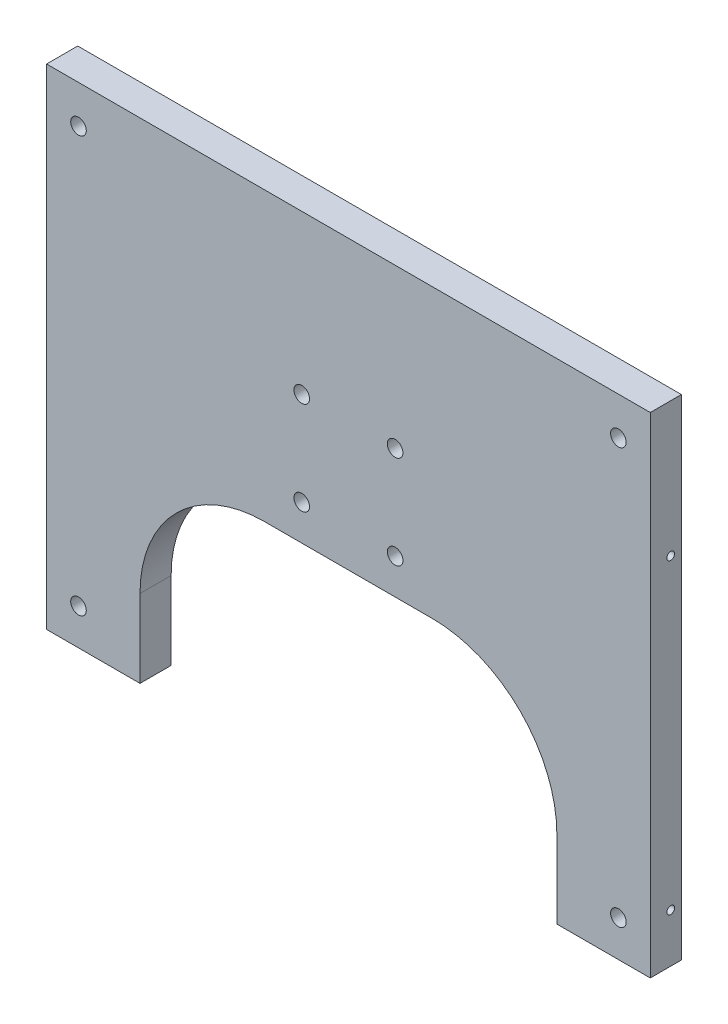
ISO-10303-21;
HEADER;
FILE_DESCRIPTION(('STEP AP214'),'2;1');
FILE_NAME('part.step','',(''),(''),'','','');
FILE_SCHEMA(('AUTOMOTIVE_DESIGN { 1 0 10303 214 1 1 1 1 }'));
ENDSEC;
DATA;
#1=APPLICATION_CONTEXT('core data for automotive mechanical design processes');
#2=APPLICATION_PROTOCOL_DEFINITION('international standard','automotive_design',2000,#1);
#3=PRODUCT_CONTEXT('',#1,'mechanical');
#4=PRODUCT('Part','Part','',(#3));
#5=PRODUCT_RELATED_PRODUCT_CATEGORY('part','',(#4));
#6=PRODUCT_DEFINITION_FORMATION('','',#4);
#7=PRODUCT_DEFINITION_CONTEXT('part definition',#1,'design');
#8=PRODUCT_DEFINITION('design','',#6,#7);
#9=PRODUCT_DEFINITION_SHAPE('','',#8);
#10=(LENGTH_UNIT() NAMED_UNIT(*) SI_UNIT(.MILLI.,.METRE.));
#11=(NAMED_UNIT(*) PLANE_ANGLE_UNIT() SI_UNIT($,.RADIAN.));
#12=(NAMED_UNIT(*) SI_UNIT($,.STERADIAN.) SOLID_ANGLE_UNIT());
#13=UNCERTAINTY_MEASURE_WITH_UNIT(LENGTH_MEASURE(1.E-05),#10,'distance_accuracy_value','');
#14=(GEOMETRIC_REPRESENTATION_CONTEXT(3) GLOBAL_UNCERTAINTY_ASSIGNED_CONTEXT((#13)) GLOBAL_UNIT_ASSIGNED_CONTEXT((#10,
#11,#12)) REPRESENTATION_CONTEXT('',''));
#15=CARTESIAN_POINT('',(0.,0.,0.));
#16=DIRECTION('',(0.,0.,1.));
#17=DIRECTION('',(1.,0.,0.));
#18=AXIS2_PLACEMENT_3D('',#15,#16,#17);
#19=CARTESIAN_POINT('',(12.6999999999998,10.7138543348663,-12.7));
#20=DIRECTION('',(-1.,0.,0.));
#21=DIRECTION('',(0.,-1.,0.));
#22=AXIS2_PLACEMENT_3D('',#19,#20,#21);
#23=PLANE('',#22);
#24=CARTESIAN_POINT('',(12.6999999999998,-169.225348003967,-8.34709420208296));
#25=DIRECTION('',(-1.,0.,0.));
#26=DIRECTION('',(0.,-1.,0.));
#27=AXIS2_PLACEMENT_3D('',#24,#25,#26);
#28=CIRCLE('',#27,1.58749999999999);
#29=CARTESIAN_POINT('',(12.6999999999998,-170.812848003967,-8.34709420208296));
#30=VERTEX_POINT('',#29);
#31=EDGE_CURVE('E143',#30,#30,#28,.T.);
#32=ORIENTED_EDGE('',*,*,#31,.F.);
#33=EDGE_LOOP('',(#32));
#34=FACE_BOUND('',#33,.T.);
#35=CARTESIAN_POINT('',(12.6999999999998,-44.1168336207156,-8.34709420208296));
#36=DIRECTION('',(-1.,0.,0.));
#37=DIRECTION('',(0.,-1.,0.));
#38=AXIS2_PLACEMENT_3D('',#35,#36,#37);
#39=CIRCLE('',#38,1.5875);
#40=CARTESIAN_POINT('',(12.6999999999998,-45.7043336207156,-8.34709420208296));
#41=VERTEX_POINT('',#40);
#42=EDGE_CURVE('E147',#41,#41,#39,.T.);
#43=ORIENTED_EDGE('',*,*,#42,.F.);
#44=EDGE_LOOP('',(#43));
#45=FACE_BOUND('',#44,.T.);
#46=DIRECTION('',(0.,-1.,0.));
#47=VECTOR('',#46,1.);
#48=CARTESIAN_POINT('',(12.6999999999998,10.7138543348663,0.));
#49=LINE('',#48,#47);
#50=CARTESIAN_POINT('',(12.6999999999998,10.7138543348663,0.));
#51=VERTEX_POINT('',#50);
#52=CARTESIAN_POINT('',(12.6999999999998,-189.051843155405,0.));
#53=VERTEX_POINT('',#52);
#54=EDGE_CURVE('E196',#51,#53,#49,.T.);
#55=ORIENTED_EDGE('',*,*,#54,.F.);
#56=DIRECTION('',(0.,0.,1.));
#57=VECTOR('',#56,1.);
#58=CARTESIAN_POINT('',(12.6999999999998,10.7138543348663,-12.7));
#59=LINE('',#58,#57);
#60=CARTESIAN_POINT('',(12.6999999999998,10.7138543348663,-12.7));
#61=VERTEX_POINT('',#60);
#62=EDGE_CURVE('E242',#61,#51,#59,.T.);
#63=ORIENTED_EDGE('',*,*,#62,.F.);
#64=DIRECTION('',(0.,-1.,0.));
#65=VECTOR('',#64,1.);
#66=CARTESIAN_POINT('',(12.6999999999998,10.7138543348663,-12.7));
#67=LINE('',#66,#65);
#68=CARTESIAN_POINT('',(12.6999999999998,-189.051843155405,-12.7));
#69=VERTEX_POINT('',#68);
#70=EDGE_CURVE('E197',#61,#69,#67,.T.);
#71=ORIENTED_EDGE('',*,*,#70,.T.);
#72=DIRECTION('',(0.,0.,1.));
#73=VECTOR('',#72,1.);
#74=CARTESIAN_POINT('',(12.6999999999998,-189.051843155405,-12.7));
#75=LINE('',#74,#73);
#76=EDGE_CURVE('E220',#69,#53,#75,.T.);
#77=ORIENTED_EDGE('',*,*,#76,.T.);
#78=EDGE_LOOP('',(#55,#63,#71,#77));
#79=FACE_BOUND('',#78,.T.);
#80=ADVANCED_FACE('F34',(#34,#45,#79),#23,.T.);
#81=CARTESIAN_POINT('',(258.933482757394,10.7138543348655,-12.7));
#82=DIRECTION('',(0.,1.,0.));
#83=DIRECTION('',(-1.,0.,0.));
#84=AXIS2_PLACEMENT_3D('',#81,#82,#83);
#85=PLANE('',#84);
#86=DIRECTION('',(-1.,0.,0.));
#87=VECTOR('',#86,1.);
#88=CARTESIAN_POINT('',(258.933482757394,10.7138543348655,0.));
#89=LINE('',#88,#87);
#90=CARTESIAN_POINT('',(258.933482757394,10.7138543348655,0.));
#91=VERTEX_POINT('',#90);
#92=EDGE_CURVE('E201',#91,#51,#89,.T.);
#93=ORIENTED_EDGE('',*,*,#92,.F.);
#94=DIRECTION('',(0.,0.,1.));
#95=VECTOR('',#94,1.);
#96=CARTESIAN_POINT('',(258.933482757394,10.7138543348655,-12.7));
#97=LINE('',#96,#95);
#98=CARTESIAN_POINT('',(258.933482757394,10.7138543348655,-12.7));
#99=VERTEX_POINT('',#98);
#100=EDGE_CURVE('E245',#99,#91,#97,.T.);
#101=ORIENTED_EDGE('',*,*,#100,.F.);
#102=DIRECTION('',(-1.,0.,0.));
#103=VECTOR('',#102,1.);
#104=CARTESIAN_POINT('',(258.933482757394,10.7138543348655,-12.7));
#105=LINE('',#104,#103);
#106=EDGE_CURVE('E217',#99,#61,#105,.T.);
#107=ORIENTED_EDGE('',*,*,#106,.T.);
#108=ORIENTED_EDGE('',*,*,#62,.T.);
#109=EDGE_LOOP('',(#93,#101,#107,#108));
#110=FACE_BOUND('',#109,.T.);
#111=ADVANCED_FACE('F280',(#110),#85,.T.);
#112=CARTESIAN_POINT('',(258.933482757394,10.7138543348655,-12.7));
#113=DIRECTION('',(1.,0.,0.));
#114=DIRECTION('',(0.,1.,0.));
#115=AXIS2_PLACEMENT_3D('',#112,#113,#114);
#116=PLANE('',#115);
#117=CARTESIAN_POINT('',(258.933482757393,-169.225348003968,-8.34709420208296));
#118=DIRECTION('',(1.,0.,0.));
#119=DIRECTION('',(0.,1.,0.));
#120=AXIS2_PLACEMENT_3D('',#117,#118,#119);
#121=CIRCLE('',#120,1.58749999999999);
#122=CARTESIAN_POINT('',(258.933482757393,-167.637848003968,-8.34709420208296));
#123=VERTEX_POINT('',#122);
#124=EDGE_CURVE('E38',#123,#123,#121,.T.);
#125=ORIENTED_EDGE('',*,*,#124,.F.);
#126=EDGE_LOOP('',(#125));
#127=FACE_BOUND('',#126,.T.);
#128=CARTESIAN_POINT('',(258.933482757394,-44.1168336207165,-8.34709420208296));
#129=DIRECTION('',(1.,0.,0.));
#130=DIRECTION('',(0.,1.,0.));
#131=AXIS2_PLACEMENT_3D('',#128,#129,#130);
#132=CIRCLE('',#131,1.5875);
#133=CARTESIAN_POINT('',(258.933482757394,-42.5293336207165,-8.34709420208296));
#134=VERTEX_POINT('',#133);
#135=EDGE_CURVE('E139',#134,#134,#132,.T.);
#136=ORIENTED_EDGE('',*,*,#135,.F.);
#137=EDGE_LOOP('',(#136));
#138=FACE_BOUND('',#137,.T.);
#139=DIRECTION('',(0.,1.,0.));
#140=VECTOR('',#139,1.);
#141=CARTESIAN_POINT('',(258.933482757394,10.7138543348655,0.));
#142=LINE('',#141,#140);
#143=CARTESIAN_POINT('',(258.933482757393,-189.051843155405,0.));
#144=VERTEX_POINT('',#143);
#145=EDGE_CURVE('E237',#144,#91,#142,.T.);
#146=ORIENTED_EDGE('',*,*,#145,.F.);
#147=DIRECTION('',(0.,0.,1.));
#148=VECTOR('',#147,1.);
#149=CARTESIAN_POINT('',(258.933482757393,-189.051843155405,-12.7));
#150=LINE('',#149,#148);
#151=CARTESIAN_POINT('',(258.933482757393,-189.051843155405,-12.7));
#152=VERTEX_POINT('',#151);
#153=EDGE_CURVE('E247',#152,#144,#150,.T.);
#154=ORIENTED_EDGE('',*,*,#153,.F.);
#155=DIRECTION('',(0.,1.,0.));
#156=VECTOR('',#155,1.);
#157=CARTESIAN_POINT('',(258.933482757394,10.7138543348655,-12.7));
#158=LINE('',#157,#156);
#159=EDGE_CURVE('E214',#152,#99,#158,.T.);
#160=ORIENTED_EDGE('',*,*,#159,.T.);
#161=ORIENTED_EDGE('',*,*,#100,.T.);
#162=EDGE_LOOP('',(#146,#154,#160,#161));
#163=FACE_BOUND('',#162,.T.);
#164=ADVANCED_FACE('F276',(#127,#138,#163),#116,.T.);
#165=CARTESIAN_POINT('',(258.933482757393,-189.051843155405,-12.7));
#166=DIRECTION('',(0.,-1.,0.));
#167=DIRECTION('',(1.,0.,0.));
#168=AXIS2_PLACEMENT_3D('',#165,#166,#167);
#169=PLANE('',#168);
#170=DIRECTION('',(1.,0.,0.));
#171=VECTOR('',#170,1.);
#172=CARTESIAN_POINT('',(258.933482757393,-189.051843155405,0.));
#173=LINE('',#172,#171);
#174=CARTESIAN_POINT('',(220.833482757393,-189.051843155405,0.));
#175=VERTEX_POINT('',#174);
#176=EDGE_CURVE('E234',#175,#144,#173,.T.);
#177=ORIENTED_EDGE('',*,*,#176,.F.);
#178=DIRECTION('',(0.,0.,1.));
#179=VECTOR('',#178,1.);
#180=CARTESIAN_POINT('',(220.833482757393,-189.051843155405,-12.7));
#181=LINE('',#180,#179);
#182=CARTESIAN_POINT('',(220.833482757393,-189.051843155405,-12.7));
#183=VERTEX_POINT('',#182);
#184=EDGE_CURVE('E249',#183,#175,#181,.T.);
#185=ORIENTED_EDGE('',*,*,#184,.F.);
#186=DIRECTION('',(1.,0.,0.));
#187=VECTOR('',#186,1.);
#188=CARTESIAN_POINT('',(258.933482757393,-189.051843155405,-12.7));
#189=LINE('',#188,#187);
#190=EDGE_CURVE('E211',#183,#152,#189,.T.);
#191=ORIENTED_EDGE('',*,*,#190,.T.);
#192=ORIENTED_EDGE('',*,*,#153,.T.);
#193=EDGE_LOOP('',(#177,#185,#191,#192));
#194=FACE_BOUND('',#193,.T.);
#195=ADVANCED_FACE('F279',(#194),#169,.T.);
#196=CARTESIAN_POINT('',(220.833482757393,-189.051843155405,-12.7));
#197=DIRECTION('',(-1.,0.,0.));
#198=DIRECTION('',(0.,-1.,0.));
#199=AXIS2_PLACEMENT_3D('',#196,#197,#198);
#200=PLANE('',#199);
#201=DIRECTION('',(0.,-1.,0.));
#202=VECTOR('',#201,1.);
#203=CARTESIAN_POINT('',(220.833482757393,-189.051843155405,0.));
#204=LINE('',#203,#202);
#205=CARTESIAN_POINT('',(220.833482757393,-157.301843155405,0.));
#206=VERTEX_POINT('',#205);
#207=EDGE_CURVE('E232',#206,#175,#204,.T.);
#208=ORIENTED_EDGE('',*,*,#207,.F.);
#209=DIRECTION('',(0.,0.,1.));
#210=VECTOR('',#209,1.);
#211=CARTESIAN_POINT('',(220.833482757393,-157.301843155405,-12.7));
#212=LINE('',#211,#210);
#213=CARTESIAN_POINT('',(220.833482757393,-157.301843155405,-12.7));
#214=VERTEX_POINT('',#213);
#215=EDGE_CURVE('E259',#206,#214,#212,.F.);
#216=ORIENTED_EDGE('',*,*,#215,.T.);
#217=DIRECTION('',(0.,-1.,0.));
#218=VECTOR('',#217,1.);
#219=CARTESIAN_POINT('',(220.833482757393,-189.051843155405,-12.7));
#220=LINE('',#219,#218);
#221=EDGE_CURVE('E209',#214,#183,#220,.T.);
#222=ORIENTED_EDGE('',*,*,#221,.T.);
#223=ORIENTED_EDGE('',*,*,#184,.T.);
#224=EDGE_LOOP('',(#208,#216,#222,#223));
#225=FACE_BOUND('',#224,.T.);
#226=ADVANCED_FACE('F340',(#225),#200,.T.);
#227=CARTESIAN_POINT('',(50.7999999999998,-106.501843155405,-12.7));
#228=DIRECTION('',(0.,-1.,0.));
#229=DIRECTION('',(1.,0.,0.));
#230=AXIS2_PLACEMENT_3D('',#227,#228,#229);
#231=PLANE('',#230);
#232=DIRECTION('',(1.,0.,0.));
#233=VECTOR('',#232,1.);
#234=CARTESIAN_POINT('',(50.7999999999998,-106.501843155405,-12.7));
#235=LINE('',#234,#233);
#236=CARTESIAN_POINT('',(101.6,-106.501843155405,-12.7));
#237=VERTEX_POINT('',#236);
#238=CARTESIAN_POINT('',(170.033482757393,-106.501843155405,-12.7));
#239=VERTEX_POINT('',#238);
#240=EDGE_CURVE('E206',#237,#239,#235,.T.);
#241=ORIENTED_EDGE('',*,*,#240,.T.);
#242=DIRECTION('',(0.,0.,1.));
#243=VECTOR('',#242,1.);
#244=CARTESIAN_POINT('',(170.033482757394,-106.501843155405,0.));
#245=LINE('',#244,#243);
#246=CARTESIAN_POINT('',(170.033482757393,-106.501843155405,0.));
#247=VERTEX_POINT('',#246);
#248=EDGE_CURVE('E256',#239,#247,#245,.T.);
#249=ORIENTED_EDGE('',*,*,#248,.T.);
#250=DIRECTION('',(1.,0.,0.));
#251=VECTOR('',#250,1.);
#252=CARTESIAN_POINT('',(50.7999999999998,-106.501843155405,0.));
#253=LINE('',#252,#251);
#254=CARTESIAN_POINT('',(101.6,-106.501843155405,0.));
#255=VERTEX_POINT('',#254);
#256=EDGE_CURVE('E229',#255,#247,#253,.T.);
#257=ORIENTED_EDGE('',*,*,#256,.F.);
#258=DIRECTION('',(0.,0.,1.));
#259=VECTOR('',#258,1.);
#260=CARTESIAN_POINT('',(101.6,-106.501843155405,-12.7));
#261=LINE('',#260,#259);
#262=EDGE_CURVE('E244',#255,#237,#261,.F.);
#263=ORIENTED_EDGE('',*,*,#262,.T.);
#264=EDGE_LOOP('',(#241,#249,#257,#263));
#265=FACE_BOUND('',#264,.T.);
#266=ADVANCED_FACE('F310',(#265),#231,.T.);
#267=CARTESIAN_POINT('',(50.7999999999998,-189.051843155405,-12.7));
#268=DIRECTION('',(1.,0.,0.));
#269=DIRECTION('',(0.,0.,-1.));
#270=AXIS2_PLACEMENT_3D('',#267,#268,#269);
#271=PLANE('',#270);
#272=DIRECTION('',(0.,1.,0.));
#273=VECTOR('',#272,1.);
#274=CARTESIAN_POINT('',(50.7999999999998,-189.051843155405,-12.7));
#275=LINE('',#274,#273);
#276=CARTESIAN_POINT('',(50.7999999999998,-189.051843155405,-12.7));
#277=VERTEX_POINT('',#276);
#278=CARTESIAN_POINT('',(50.7999999999998,-157.301843155405,-12.7));
#279=VERTEX_POINT('',#278);
#280=EDGE_CURVE('E204',#277,#279,#275,.T.);
#281=ORIENTED_EDGE('',*,*,#280,.T.);
#282=DIRECTION('',(0.,0.,1.));
#283=VECTOR('',#282,1.);
#284=CARTESIAN_POINT('',(50.7999999999998,-157.301843155405,0.));
#285=LINE('',#284,#283);
#286=CARTESIAN_POINT('',(50.7999999999998,-157.301843155405,0.));
#287=VERTEX_POINT('',#286);
#288=EDGE_CURVE('E261',#279,#287,#285,.T.);
#289=ORIENTED_EDGE('',*,*,#288,.T.);
#290=DIRECTION('',(0.,1.,0.));
#291=VECTOR('',#290,1.);
#292=CARTESIAN_POINT('',(50.7999999999998,-189.051843155405,0.));
#293=LINE('',#292,#291);
#294=CARTESIAN_POINT('',(50.7999999999998,-189.051843155405,0.));
#295=VERTEX_POINT('',#294);
#296=EDGE_CURVE('E226',#295,#287,#293,.T.);
#297=ORIENTED_EDGE('',*,*,#296,.F.);
#298=DIRECTION('',(0.,0.,1.));
#299=VECTOR('',#298,1.);
#300=CARTESIAN_POINT('',(50.7999999999998,-189.051843155405,-12.7));
#301=LINE('',#300,#299);
#302=EDGE_CURVE('E252',#277,#295,#301,.T.);
#303=ORIENTED_EDGE('',*,*,#302,.F.);
#304=EDGE_LOOP('',(#281,#289,#297,#303));
#305=FACE_BOUND('',#304,.T.);
#306=ADVANCED_FACE('F307',(#305),#271,.T.);
#307=CARTESIAN_POINT('',(12.6999999999998,-189.051843155405,-12.7));
#308=DIRECTION('',(0.,-1.,0.));
#309=DIRECTION('',(0.,0.,-1.));
#310=AXIS2_PLACEMENT_3D('',#307,#308,#309);
#311=PLANE('',#310);
#312=DIRECTION('',(1.,0.,0.));
#313=VECTOR('',#312,1.);
#314=CARTESIAN_POINT('',(12.6999999999998,-189.051843155405,0.));
#315=LINE('',#314,#313);
#316=EDGE_CURVE('E223',#53,#295,#315,.T.);
#317=ORIENTED_EDGE('',*,*,#316,.F.);
#318=ORIENTED_EDGE('',*,*,#76,.F.);
#319=DIRECTION('',(1.,0.,0.));
#320=VECTOR('',#319,1.);
#321=CARTESIAN_POINT('',(12.6999999999998,-189.051843155405,-12.7));
#322=LINE('',#321,#320);
#323=EDGE_CURVE('E200',#69,#277,#322,.T.);
#324=ORIENTED_EDGE('',*,*,#323,.T.);
#325=ORIENTED_EDGE('',*,*,#302,.T.);
#326=EDGE_LOOP('',(#317,#318,#324,#325));
#327=FACE_BOUND('',#326,.T.);
#328=ADVANCED_FACE('F304',(#327),#311,.T.);
#329=CARTESIAN_POINT('',(0.,0.,-12.7));
#330=DIRECTION('',(0.,0.,1.));
#331=DIRECTION('',(1.,0.,0.));
#332=AXIS2_PLACEMENT_3D('',#329,#330,#331);
#333=PLANE('',#332);
#334=CARTESIAN_POINT('',(25.7061628891201,-174.233423282267,-12.7));
#335=DIRECTION('',(0.,0.,-1.));
#336=DIRECTION('',(-1.,0.,0.));
#337=AXIS2_PLACEMENT_3D('',#334,#335,#336);
#338=CIRCLE('',#337,3.175);
#339=CARTESIAN_POINT('',(22.5311628891201,-174.233423282267,-12.7));
#340=VERTEX_POINT('',#339);
#341=EDGE_CURVE('E148',#340,#340,#338,.T.);
#342=ORIENTED_EDGE('',*,*,#341,.F.);
#343=EDGE_LOOP('',(#342));
#344=FACE_BOUND('',#343,.T.);
#345=CARTESIAN_POINT('',(116.766741378697,-92.064314728551,-12.7));
#346=DIRECTION('',(0.,0.,-1.));
#347=DIRECTION('',(-1.,0.,0.));
#348=AXIS2_PLACEMENT_3D('',#345,#346,#347);
#349=CIRCLE('',#348,3.175);
#350=CARTESIAN_POINT('',(113.591741378697,-92.064314728551,-12.7));
#351=VERTEX_POINT('',#350);
#352=EDGE_CURVE('E154',#351,#351,#349,.T.);
#353=ORIENTED_EDGE('',*,*,#352,.F.);
#354=EDGE_LOOP('',(#353));
#355=FACE_BOUND('',#354,.T.);
#356=CARTESIAN_POINT('',(154.866741378697,-92.0643147285511,-12.7));
#357=DIRECTION('',(0.,0.,-1.));
#358=DIRECTION('',(-1.,0.,0.));
#359=AXIS2_PLACEMENT_3D('',#356,#357,#358);
#360=CIRCLE('',#359,3.17500000000001);
#361=CARTESIAN_POINT('',(151.691741378697,-92.0643147285511,-12.7));
#362=VERTEX_POINT('',#361);
#363=EDGE_CURVE('E160',#362,#362,#360,.T.);
#364=ORIENTED_EDGE('',*,*,#363,.F.);
#365=EDGE_LOOP('',(#364));
#366=FACE_BOUND('',#365,.T.);
#367=CARTESIAN_POINT('',(245.927319868274,-174.233423282268,-12.7));
#368=DIRECTION('',(0.,0.,-1.));
#369=DIRECTION('',(-1.,0.,0.));
#370=AXIS2_PLACEMENT_3D('',#367,#368,#369);
#371=CIRCLE('',#370,3.17500000000001);
#372=CARTESIAN_POINT('',(242.752319868274,-174.233423282268,-12.7));
#373=VERTEX_POINT('',#372);
#374=EDGE_CURVE('E166',#373,#373,#371,.T.);
#375=ORIENTED_EDGE('',*,*,#374,.F.);
#376=EDGE_LOOP('',(#375));
#377=FACE_BOUND('',#376,.T.);
#378=CARTESIAN_POINT('',(154.866741378697,-53.9643147285511,-12.7));
#379=DIRECTION('',(0.,0.,-1.));
#380=DIRECTION('',(-1.,0.,0.));
#381=AXIS2_PLACEMENT_3D('',#378,#379,#380);
#382=CIRCLE('',#381,3.17500000000001);
#383=CARTESIAN_POINT('',(151.691741378697,-53.9643147285511,-12.7));
#384=VERTEX_POINT('',#383);
#385=EDGE_CURVE('E172',#384,#384,#382,.T.);
#386=ORIENTED_EDGE('',*,*,#385,.F.);
#387=EDGE_LOOP('',(#386));
#388=FACE_BOUND('',#387,.T.);
#389=CARTESIAN_POINT('',(245.927319868274,-4.74797050600834,-12.7));
#390=DIRECTION('',(0.,0.,-1.));
#391=DIRECTION('',(-1.,0.,0.));
#392=AXIS2_PLACEMENT_3D('',#389,#390,#391);
#393=CIRCLE('',#392,3.17500000000001);
#394=CARTESIAN_POINT('',(242.752319868274,-4.74797050600834,-12.7));
#395=VERTEX_POINT('',#394);
#396=EDGE_CURVE('E178',#395,#395,#393,.T.);
#397=ORIENTED_EDGE('',*,*,#396,.F.);
#398=EDGE_LOOP('',(#397));
#399=FACE_BOUND('',#398,.T.);
#400=CARTESIAN_POINT('',(116.766741378697,-53.964314728551,-12.7));
#401=DIRECTION('',(0.,0.,-1.));
#402=DIRECTION('',(-1.,0.,0.));
#403=AXIS2_PLACEMENT_3D('',#400,#401,#402);
#404=CIRCLE('',#403,3.175);
#405=CARTESIAN_POINT('',(113.591741378697,-53.964314728551,-12.7));
#406=VERTEX_POINT('',#405);
#407=EDGE_CURVE('E184',#406,#406,#404,.T.);
#408=ORIENTED_EDGE('',*,*,#407,.F.);
#409=EDGE_LOOP('',(#408));
#410=FACE_BOUND('',#409,.T.);
#411=CARTESIAN_POINT('',(25.7061628891206,-4.7479705060077,-12.7));
#412=DIRECTION('',(0.,0.,-1.));
#413=DIRECTION('',(-1.,0.,0.));
#414=AXIS2_PLACEMENT_3D('',#411,#412,#413);
#415=CIRCLE('',#414,3.175);
#416=CARTESIAN_POINT('',(22.5311628891206,-4.7479705060077,-12.7));
#417=VERTEX_POINT('',#416);
#418=EDGE_CURVE('E190',#417,#417,#415,.T.);
#419=ORIENTED_EDGE('',*,*,#418,.F.);
#420=EDGE_LOOP('',(#419));
#421=FACE_BOUND('',#420,.T.);
#422=ORIENTED_EDGE('',*,*,#70,.F.);
#423=ORIENTED_EDGE('',*,*,#106,.F.);
#424=ORIENTED_EDGE('',*,*,#159,.F.);
#425=ORIENTED_EDGE('',*,*,#190,.F.);
#426=ORIENTED_EDGE('',*,*,#221,.F.);
#427=CARTESIAN_POINT('',(170.033482757393,-157.301843155405,-12.7));
#428=DIRECTION('',(0.,0.,1.));
#429=DIRECTION('',(1.,0.,0.));
#430=AXIS2_PLACEMENT_3D('',#427,#428,#429);
#431=CIRCLE('',#430,50.8);
#432=EDGE_CURVE('E265',#214,#239,#431,.T.);
#433=ORIENTED_EDGE('',*,*,#432,.T.);
#434=ORIENTED_EDGE('',*,*,#240,.F.);
#435=CARTESIAN_POINT('',(101.6,-157.301843155405,-12.7));
#436=DIRECTION('',(0.,0.,1.));
#437=DIRECTION('',(1.,0.,0.));
#438=AXIS2_PLACEMENT_3D('',#435,#436,#437);
#439=CIRCLE('',#438,50.8);
#440=EDGE_CURVE('E11',#237,#279,#439,.T.);
#441=ORIENTED_EDGE('',*,*,#440,.T.);
#442=ORIENTED_EDGE('',*,*,#280,.F.);
#443=ORIENTED_EDGE('',*,*,#323,.F.);
#444=EDGE_LOOP('',(#422,#423,#424,#425,#426,#433,#434,#441,#442,#443));
#445=FACE_BOUND('',#444,.T.);
#446=ADVANCED_FACE('F295',(#344,#355,#366,#377,#388,#399,#410,#421,#445),#333,.F.);
#447=CARTESIAN_POINT('',(0.,0.,0.));
#448=DIRECTION('',(0.,0.,1.));
#449=DIRECTION('',(1.,0.,0.));
#450=AXIS2_PLACEMENT_3D('',#447,#448,#449);
#451=PLANE('',#450);
#452=CARTESIAN_POINT('',(25.7061628891201,-174.233423282267,0.));
#453=DIRECTION('',(0.,0.,-1.));
#454=DIRECTION('',(-1.,0.,0.));
#455=AXIS2_PLACEMENT_3D('',#452,#453,#454);
#456=CIRCLE('',#455,3.175);
#457=CARTESIAN_POINT('',(22.5311628891201,-174.233423282267,0.));
#458=VERTEX_POINT('',#457);
#459=EDGE_CURVE('E151',#458,#458,#456,.T.);
#460=ORIENTED_EDGE('',*,*,#459,.T.);
#461=EDGE_LOOP('',(#460));
#462=FACE_BOUND('',#461,.T.);
#463=CARTESIAN_POINT('',(116.766741378697,-92.064314728551,0.));
#464=DIRECTION('',(0.,0.,-1.));
#465=DIRECTION('',(-1.,0.,0.));
#466=AXIS2_PLACEMENT_3D('',#463,#464,#465);
#467=CIRCLE('',#466,3.175);
#468=CARTESIAN_POINT('',(113.591741378697,-92.064314728551,0.));
#469=VERTEX_POINT('',#468);
#470=EDGE_CURVE('E157',#469,#469,#467,.T.);
#471=ORIENTED_EDGE('',*,*,#470,.T.);
#472=EDGE_LOOP('',(#471));
#473=FACE_BOUND('',#472,.T.);
#474=CARTESIAN_POINT('',(154.866741378697,-92.0643147285511,0.));
#475=DIRECTION('',(0.,0.,-1.));
#476=DIRECTION('',(-1.,0.,0.));
#477=AXIS2_PLACEMENT_3D('',#474,#475,#476);
#478=CIRCLE('',#477,3.17499999999998);
#479=CARTESIAN_POINT('',(151.691741378697,-92.0643147285511,0.));
#480=VERTEX_POINT('',#479);
#481=EDGE_CURVE('E163',#480,#480,#478,.T.);
#482=ORIENTED_EDGE('',*,*,#481,.T.);
#483=EDGE_LOOP('',(#482));
#484=FACE_BOUND('',#483,.T.);
#485=CARTESIAN_POINT('',(245.927319868274,-174.233423282268,0.));
#486=DIRECTION('',(0.,0.,-1.));
#487=DIRECTION('',(-1.,0.,0.));
#488=AXIS2_PLACEMENT_3D('',#485,#486,#487);
#489=CIRCLE('',#488,3.17499999999998);
#490=CARTESIAN_POINT('',(242.752319868274,-174.233423282268,0.));
#491=VERTEX_POINT('',#490);
#492=EDGE_CURVE('E169',#491,#491,#489,.T.);
#493=ORIENTED_EDGE('',*,*,#492,.T.);
#494=EDGE_LOOP('',(#493));
#495=FACE_BOUND('',#494,.T.);
#496=CARTESIAN_POINT('',(154.866741378697,-53.9643147285511,0.));
#497=DIRECTION('',(0.,0.,-1.));
#498=DIRECTION('',(-1.,0.,0.));
#499=AXIS2_PLACEMENT_3D('',#496,#497,#498);
#500=CIRCLE('',#499,3.17499999999998);
#501=CARTESIAN_POINT('',(151.691741378697,-53.9643147285511,0.));
#502=VERTEX_POINT('',#501);
#503=EDGE_CURVE('E175',#502,#502,#500,.T.);
#504=ORIENTED_EDGE('',*,*,#503,.T.);
#505=EDGE_LOOP('',(#504));
#506=FACE_BOUND('',#505,.T.);
#507=CARTESIAN_POINT('',(245.927319868274,-4.74797050600834,0.));
#508=DIRECTION('',(0.,0.,-1.));
#509=DIRECTION('',(-1.,0.,0.));
#510=AXIS2_PLACEMENT_3D('',#507,#508,#509);
#511=CIRCLE('',#510,3.17499999999998);
#512=CARTESIAN_POINT('',(242.752319868274,-4.74797050600834,0.));
#513=VERTEX_POINT('',#512);
#514=EDGE_CURVE('E181',#513,#513,#511,.T.);
#515=ORIENTED_EDGE('',*,*,#514,.T.);
#516=EDGE_LOOP('',(#515));
#517=FACE_BOUND('',#516,.T.);
#518=CARTESIAN_POINT('',(116.766741378697,-53.964314728551,0.));
#519=DIRECTION('',(0.,0.,-1.));
#520=DIRECTION('',(-1.,0.,0.));
#521=AXIS2_PLACEMENT_3D('',#518,#519,#520);
#522=CIRCLE('',#521,3.175);
#523=CARTESIAN_POINT('',(113.591741378697,-53.964314728551,0.));
#524=VERTEX_POINT('',#523);
#525=EDGE_CURVE('E187',#524,#524,#522,.T.);
#526=ORIENTED_EDGE('',*,*,#525,.T.);
#527=EDGE_LOOP('',(#526));
#528=FACE_BOUND('',#527,.T.);
#529=CARTESIAN_POINT('',(25.7061628891206,-4.7479705060077,0.));
#530=DIRECTION('',(0.,0.,-1.));
#531=DIRECTION('',(-1.,0.,0.));
#532=AXIS2_PLACEMENT_3D('',#529,#530,#531);
#533=CIRCLE('',#532,3.175);
#534=CARTESIAN_POINT('',(22.5311628891206,-4.7479705060077,0.));
#535=VERTEX_POINT('',#534);
#536=EDGE_CURVE('E193',#535,#535,#533,.T.);
#537=ORIENTED_EDGE('',*,*,#536,.T.);
#538=EDGE_LOOP('',(#537));
#539=FACE_BOUND('',#538,.T.);
#540=ORIENTED_EDGE('',*,*,#54,.T.);
#541=ORIENTED_EDGE('',*,*,#316,.T.);
#542=ORIENTED_EDGE('',*,*,#296,.T.);
#543=CARTESIAN_POINT('',(101.6,-157.301843155405,0.));
#544=DIRECTION('',(0.,0.,1.));
#545=DIRECTION('',(1.,0.,0.));
#546=AXIS2_PLACEMENT_3D('',#543,#544,#545);
#547=CIRCLE('',#546,50.8);
#548=EDGE_CURVE('E43',#287,#255,#547,.F.);
#549=ORIENTED_EDGE('',*,*,#548,.T.);
#550=ORIENTED_EDGE('',*,*,#256,.T.);
#551=CARTESIAN_POINT('',(170.033482757393,-157.301843155405,0.));
#552=DIRECTION('',(0.,0.,1.));
#553=DIRECTION('',(1.,0.,0.));
#554=AXIS2_PLACEMENT_3D('',#551,#552,#553);
#555=CIRCLE('',#554,50.8);
#556=EDGE_CURVE('E263',#247,#206,#555,.F.);
#557=ORIENTED_EDGE('',*,*,#556,.T.);
#558=ORIENTED_EDGE('',*,*,#207,.T.);
#559=ORIENTED_EDGE('',*,*,#176,.T.);
#560=ORIENTED_EDGE('',*,*,#145,.T.);
#561=ORIENTED_EDGE('',*,*,#92,.T.);
#562=EDGE_LOOP('',(#540,#541,#542,#549,#550,#557,#558,#559,#560,#561));
#563=FACE_BOUND('',#562,.T.);
#564=ADVANCED_FACE('F288',(#462,#473,#484,#495,#506,#517,#528,#539,#563),#451,.T.);
#565=CARTESIAN_POINT('',(25.7061628891206,-4.7479705060077,-12.7));
#566=DIRECTION('',(0.,0.,-1.));
#567=DIRECTION('',(-1.,0.,0.));
#568=AXIS2_PLACEMENT_3D('',#565,#566,#567);
#569=CYLINDRICAL_SURFACE('',#568,3.175);
#570=ORIENTED_EDGE('',*,*,#536,.F.);
#571=EDGE_LOOP('',(#570));
#572=FACE_BOUND('',#571,.T.);
#573=ORIENTED_EDGE('',*,*,#418,.T.);
#574=EDGE_LOOP('',(#573));
#575=FACE_BOUND('',#574,.T.);
#576=ADVANCED_FACE('F348',(#572,#575),#569,.F.);
#577=CARTESIAN_POINT('',(116.766741378697,-53.964314728551,-12.7));
#578=DIRECTION('',(0.,0.,-1.));
#579=DIRECTION('',(-1.,0.,0.));
#580=AXIS2_PLACEMENT_3D('',#577,#578,#579);
#581=CYLINDRICAL_SURFACE('',#580,3.175);
#582=ORIENTED_EDGE('',*,*,#525,.F.);
#583=EDGE_LOOP('',(#582));
#584=FACE_BOUND('',#583,.T.);
#585=ORIENTED_EDGE('',*,*,#407,.T.);
#586=EDGE_LOOP('',(#585));
#587=FACE_BOUND('',#586,.T.);
#588=ADVANCED_FACE('F355',(#584,#587),#581,.F.);
#589=CARTESIAN_POINT('',(245.927319868274,-4.74797050600834,-12.7));
#590=DIRECTION('',(0.,0.,-1.));
#591=DIRECTION('',(-1.,0.,0.));
#592=AXIS2_PLACEMENT_3D('',#589,#590,#591);
#593=CYLINDRICAL_SURFACE('',#592,3.175);
#594=ORIENTED_EDGE('',*,*,#514,.F.);
#595=EDGE_LOOP('',(#594));
#596=FACE_BOUND('',#595,.T.);
#597=ORIENTED_EDGE('',*,*,#396,.T.);
#598=EDGE_LOOP('',(#597));
#599=FACE_BOUND('',#598,.T.);
#600=ADVANCED_FACE('F359',(#596,#599),#593,.F.);
#601=CARTESIAN_POINT('',(154.866741378697,-53.9643147285511,-12.7));
#602=DIRECTION('',(0.,0.,-1.));
#603=DIRECTION('',(-1.,0.,0.));
#604=AXIS2_PLACEMENT_3D('',#601,#602,#603);
#605=CYLINDRICAL_SURFACE('',#604,3.175);
#606=ORIENTED_EDGE('',*,*,#503,.F.);
#607=EDGE_LOOP('',(#606));
#608=FACE_BOUND('',#607,.T.);
#609=ORIENTED_EDGE('',*,*,#385,.T.);
#610=EDGE_LOOP('',(#609));
#611=FACE_BOUND('',#610,.T.);
#612=ADVANCED_FACE('F363',(#608,#611),#605,.F.);
#613=CARTESIAN_POINT('',(245.927319868274,-174.233423282268,-12.7));
#614=DIRECTION('',(0.,0.,-1.));
#615=DIRECTION('',(-1.,0.,0.));
#616=AXIS2_PLACEMENT_3D('',#613,#614,#615);
#617=CYLINDRICAL_SURFACE('',#616,3.175);
#618=ORIENTED_EDGE('',*,*,#492,.F.);
#619=EDGE_LOOP('',(#618));
#620=FACE_BOUND('',#619,.T.);
#621=ORIENTED_EDGE('',*,*,#374,.T.);
#622=EDGE_LOOP('',(#621));
#623=FACE_BOUND('',#622,.T.);
#624=ADVANCED_FACE('F367',(#620,#623),#617,.F.);
#625=CARTESIAN_POINT('',(154.866741378697,-92.0643147285511,-12.7));
#626=DIRECTION('',(0.,0.,-1.));
#627=DIRECTION('',(-1.,0.,0.));
#628=AXIS2_PLACEMENT_3D('',#625,#626,#627);
#629=CYLINDRICAL_SURFACE('',#628,3.175);
#630=ORIENTED_EDGE('',*,*,#481,.F.);
#631=EDGE_LOOP('',(#630));
#632=FACE_BOUND('',#631,.T.);
#633=ORIENTED_EDGE('',*,*,#363,.T.);
#634=EDGE_LOOP('',(#633));
#635=FACE_BOUND('',#634,.T.);
#636=ADVANCED_FACE('F371',(#632,#635),#629,.F.);
#637=CARTESIAN_POINT('',(116.766741378697,-92.064314728551,-12.7));
#638=DIRECTION('',(0.,0.,-1.));
#639=DIRECTION('',(-1.,0.,0.));
#640=AXIS2_PLACEMENT_3D('',#637,#638,#639);
#641=CYLINDRICAL_SURFACE('',#640,3.175);
#642=ORIENTED_EDGE('',*,*,#470,.F.);
#643=EDGE_LOOP('',(#642));
#644=FACE_BOUND('',#643,.T.);
#645=ORIENTED_EDGE('',*,*,#352,.T.);
#646=EDGE_LOOP('',(#645));
#647=FACE_BOUND('',#646,.T.);
#648=ADVANCED_FACE('F375',(#644,#647),#641,.F.);
#649=CARTESIAN_POINT('',(25.7061628891201,-174.233423282267,-12.7));
#650=DIRECTION('',(0.,0.,-1.));
#651=DIRECTION('',(-1.,0.,0.));
#652=AXIS2_PLACEMENT_3D('',#649,#650,#651);
#653=CYLINDRICAL_SURFACE('',#652,3.175);
#654=ORIENTED_EDGE('',*,*,#459,.F.);
#655=EDGE_LOOP('',(#654));
#656=FACE_BOUND('',#655,.T.);
#657=ORIENTED_EDGE('',*,*,#341,.T.);
#658=EDGE_LOOP('',(#657));
#659=FACE_BOUND('',#658,.T.);
#660=ADVANCED_FACE('F322',(#656,#659),#653,.F.);
#661=CARTESIAN_POINT('',(170.033482757393,-157.301843155405,-12.7));
#662=DIRECTION('',(0.,0.,-1.));
#663=DIRECTION('',(-1.,0.,0.));
#664=AXIS2_PLACEMENT_3D('',#661,#662,#663);
#665=CYLINDRICAL_SURFACE('',#664,50.8);
#666=ORIENTED_EDGE('',*,*,#432,.F.);
#667=ORIENTED_EDGE('',*,*,#215,.F.);
#668=ORIENTED_EDGE('',*,*,#556,.F.);
#669=ORIENTED_EDGE('',*,*,#248,.F.);
#670=EDGE_LOOP('',(#666,#667,#668,#669));
#671=FACE_BOUND('',#670,.T.);
#672=ADVANCED_FACE('F314',(#671),#665,.F.);
#673=CARTESIAN_POINT('',(101.6,-157.301843155405,-12.7));
#674=DIRECTION('',(0.,0.,-1.));
#675=DIRECTION('',(-1.,0.,0.));
#676=AXIS2_PLACEMENT_3D('',#673,#674,#675);
#677=CYLINDRICAL_SURFACE('',#676,50.8);
#678=ORIENTED_EDGE('',*,*,#440,.F.);
#679=ORIENTED_EDGE('',*,*,#262,.F.);
#680=ORIENTED_EDGE('',*,*,#548,.F.);
#681=ORIENTED_EDGE('',*,*,#288,.F.);
#682=EDGE_LOOP('',(#678,#679,#680,#681));
#683=FACE_BOUND('',#682,.T.);
#684=ADVANCED_FACE('F36',(#683),#677,.F.);
#685=CARTESIAN_POINT('',(38.0999999999962,-44.1168336207156,-8.34709420208296));
#686=DIRECTION('',(-1.,0.,0.));
#687=DIRECTION('',(0.,0.,1.));
#688=AXIS2_PLACEMENT_3D('',#685,#686,#687);
#689=CONICAL_SURFACE('',#688,1.5875,1.02974425867666);
#690=CARTESIAN_POINT('',(39.0538662327025,-44.1168336207156,-8.34709420208296));
#691=VERTEX_POINT('',#690);
#692=VERTEX_LOOP('',#691);
#693=FACE_BOUND('',#692,.T.);
#694=CARTESIAN_POINT('',(38.0999999999962,-44.1168336207156,-8.34709420208296));
#695=DIRECTION('',(-1.,0.,0.));
#696=DIRECTION('',(0.,0.,1.));
#697=AXIS2_PLACEMENT_3D('',#694,#695,#696);
#698=CIRCLE('',#697,1.5875);
#699=CARTESIAN_POINT('',(38.0999999999962,-44.1168336207156,-6.75959420208296));
#700=VERTEX_POINT('',#699);
#701=EDGE_CURVE('E144',#700,#700,#698,.T.);
#702=ORIENTED_EDGE('',*,*,#701,.T.);
#703=EDGE_LOOP('',(#702));
#704=FACE_BOUND('',#703,.T.);
#705=ADVANCED_FACE('F313',(#693,#704),#689,.F.);
#706=CARTESIAN_POINT('',(-3.77475828372553E-12,-44.1168336207156,-8.34709420208296));
#707=DIRECTION('',(-1.,0.,0.));
#708=DIRECTION('',(0.,0.,1.));
#709=AXIS2_PLACEMENT_3D('',#706,#707,#708);
#710=CYLINDRICAL_SURFACE('',#709,1.5875);
#711=ORIENTED_EDGE('',*,*,#42,.T.);
#712=EDGE_LOOP('',(#711));
#713=FACE_BOUND('',#712,.T.);
#714=ORIENTED_EDGE('',*,*,#701,.F.);
#715=EDGE_LOOP('',(#714));
#716=FACE_BOUND('',#715,.T.);
#717=ADVANCED_FACE('F319',(#713,#716),#710,.F.);
#718=CARTESIAN_POINT('',(38.0999999999962,-169.225348003967,-8.34709420208296));
#719=DIRECTION('',(-1.,0.,0.));
#720=DIRECTION('',(0.,0.,1.));
#721=AXIS2_PLACEMENT_3D('',#718,#719,#720);
#722=CONICAL_SURFACE('',#721,1.58749999999999,1.02974425867665);
#723=CARTESIAN_POINT('',(39.0538662327025,-169.225348003967,-8.34709420208296));
#724=VERTEX_POINT('',#723);
#725=VERTEX_LOOP('',#724);
#726=FACE_BOUND('',#725,.T.);
#727=CARTESIAN_POINT('',(38.0999999999962,-169.225348003967,-8.34709420208296));
#728=DIRECTION('',(-1.,0.,0.));
#729=DIRECTION('',(0.,0.,1.));
#730=AXIS2_PLACEMENT_3D('',#727,#728,#729);
#731=CIRCLE('',#730,1.58749999999999);
#732=CARTESIAN_POINT('',(38.0999999999962,-169.225348003967,-6.75959420208297));
#733=VERTEX_POINT('',#732);
#734=EDGE_CURVE('E140',#733,#733,#731,.T.);
#735=ORIENTED_EDGE('',*,*,#734,.T.);
#736=EDGE_LOOP('',(#735));
#737=FACE_BOUND('',#736,.T.);
#738=ADVANCED_FACE('F385',(#726,#737),#722,.F.);
#739=CARTESIAN_POINT('',(-3.77475828372553E-12,-169.225348003967,-8.34709420208296));
#740=DIRECTION('',(-1.,0.,0.));
#741=DIRECTION('',(0.,0.,1.));
#742=AXIS2_PLACEMENT_3D('',#739,#740,#741);
#743=CYLINDRICAL_SURFACE('',#742,1.58749999999999);
#744=ORIENTED_EDGE('',*,*,#31,.T.);
#745=EDGE_LOOP('',(#744));
#746=FACE_BOUND('',#745,.T.);
#747=ORIENTED_EDGE('',*,*,#734,.F.);
#748=EDGE_LOOP('',(#747));
#749=FACE_BOUND('',#748,.T.);
#750=ADVANCED_FACE('F389',(#746,#749),#743,.F.);
#751=CARTESIAN_POINT('',(233.533482757398,-44.1168336207165,-8.34709420208296));
#752=DIRECTION('',(1.,0.,0.));
#753=DIRECTION('',(0.,0.,-1.));
#754=AXIS2_PLACEMENT_3D('',#751,#752,#753);
#755=CONICAL_SURFACE('',#754,1.5875,1.02974425867666);
#756=CARTESIAN_POINT('',(232.579616524691,-44.1168336207165,-8.34709420208296));
#757=VERTEX_POINT('',#756);
#758=VERTEX_LOOP('',#757);
#759=FACE_BOUND('',#758,.T.);
#760=CARTESIAN_POINT('',(233.533482757398,-44.1168336207165,-8.34709420208296));
#761=DIRECTION('',(1.,0.,0.));
#762=DIRECTION('',(0.,0.,-1.));
#763=AXIS2_PLACEMENT_3D('',#760,#761,#762);
#764=CIRCLE('',#763,1.5875);
#765=CARTESIAN_POINT('',(233.533482757398,-44.1168336207165,-9.93459420208296));
#766=VERTEX_POINT('',#765);
#767=EDGE_CURVE('E135',#766,#766,#764,.T.);
#768=ORIENTED_EDGE('',*,*,#767,.T.);
#769=EDGE_LOOP('',(#768));
#770=FACE_BOUND('',#769,.T.);
#771=ADVANCED_FACE('F393',(#759,#770),#755,.F.);
#772=CARTESIAN_POINT('',(271.633482757398,-44.1168336207165,-8.34709420208296));
#773=DIRECTION('',(1.,0.,0.));
#774=DIRECTION('',(0.,0.,-1.));
#775=AXIS2_PLACEMENT_3D('',#772,#773,#774);
#776=CYLINDRICAL_SURFACE('',#775,1.5875);
#777=ORIENTED_EDGE('',*,*,#135,.T.);
#778=EDGE_LOOP('',(#777));
#779=FACE_BOUND('',#778,.T.);
#780=ORIENTED_EDGE('',*,*,#767,.F.);
#781=EDGE_LOOP('',(#780));
#782=FACE_BOUND('',#781,.T.);
#783=ADVANCED_FACE('F127',(#779,#782),#776,.F.);
#784=CARTESIAN_POINT('',(233.533482757397,-169.225348003968,-8.34709420208296));
#785=DIRECTION('',(1.,0.,0.));
#786=DIRECTION('',(0.,0.,-1.));
#787=AXIS2_PLACEMENT_3D('',#784,#785,#786);
#788=CONICAL_SURFACE('',#787,1.58749999999999,1.02974425867666);
#789=CARTESIAN_POINT('',(232.579616524691,-169.225348003968,-8.34709420208296));
#790=VERTEX_POINT('',#789);
#791=VERTEX_LOOP('',#790);
#792=FACE_BOUND('',#791,.T.);
#793=CARTESIAN_POINT('',(233.533482757397,-169.225348003968,-8.34709420208296));
#794=DIRECTION('',(1.,0.,0.));
#795=DIRECTION('',(0.,0.,-1.));
#796=AXIS2_PLACEMENT_3D('',#793,#794,#795);
#797=CIRCLE('',#796,1.58749999999999);
#798=CARTESIAN_POINT('',(233.533482757397,-169.225348003968,-9.93459420208295));
#799=VERTEX_POINT('',#798);
#800=EDGE_CURVE('E131',#799,#799,#797,.T.);
#801=ORIENTED_EDGE('',*,*,#800,.T.);
#802=EDGE_LOOP('',(#801));
#803=FACE_BOUND('',#802,.T.);
#804=ADVANCED_FACE('F123',(#792,#803),#788,.F.);
#805=CARTESIAN_POINT('',(271.633482757397,-169.225348003968,-8.34709420208296));
#806=DIRECTION('',(1.,0.,0.));
#807=DIRECTION('',(0.,0.,-1.));
#808=AXIS2_PLACEMENT_3D('',#805,#806,#807);
#809=CYLINDRICAL_SURFACE('',#808,1.58749999999999);
#810=ORIENTED_EDGE('',*,*,#124,.T.);
#811=EDGE_LOOP('',(#810));
#812=FACE_BOUND('',#811,.T.);
#813=ORIENTED_EDGE('',*,*,#800,.F.);
#814=EDGE_LOOP('',(#813));
#815=FACE_BOUND('',#814,.T.);
#816=ADVANCED_FACE('F126',(#812,#815),#809,.F.);
#817=CLOSED_SHELL('',(#80,#111,#164,#195,#226,#266,#306,#328,#446,#564,#576,#588,#600,#612,#624,
#636,#648,#660,#672,#684,#705,#717,#738,#750,#771,#783,#804,#816));
#818=MANIFOLD_SOLID_BREP('B2',#817);
#819=ADVANCED_BREP_SHAPE_REPRESENTATION('',(#18,#818),#14);
#820=SHAPE_DEFINITION_REPRESENTATION(#9,#819);
ENDSEC;
END-ISO-10303-21;
